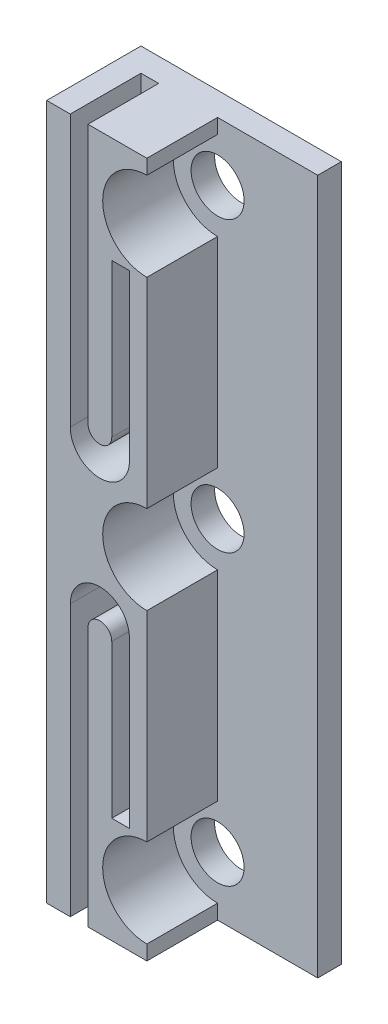
ISO-10303-21;
HEADER;
FILE_DESCRIPTION(('STEP AP214'),'2;1');
FILE_NAME('part.step','',(''),(''),'','','');
FILE_SCHEMA(('AUTOMOTIVE_DESIGN { 1 0 10303 214 1 1 1 1 }'));
ENDSEC;
DATA;
#1=APPLICATION_CONTEXT('core data for automotive mechanical design processes');
#2=APPLICATION_PROTOCOL_DEFINITION('international standard','automotive_design',2000,#1);
#3=PRODUCT_CONTEXT('',#1,'mechanical');
#4=PRODUCT('Part','Part','',(#3));
#5=PRODUCT_RELATED_PRODUCT_CATEGORY('part','',(#4));
#6=PRODUCT_DEFINITION_FORMATION('','',#4);
#7=PRODUCT_DEFINITION_CONTEXT('part definition',#1,'design');
#8=PRODUCT_DEFINITION('design','',#6,#7);
#9=PRODUCT_DEFINITION_SHAPE('','',#8);
#10=(LENGTH_UNIT() NAMED_UNIT(*) SI_UNIT(.MILLI.,.METRE.));
#11=(NAMED_UNIT(*) PLANE_ANGLE_UNIT() SI_UNIT($,.RADIAN.));
#12=(NAMED_UNIT(*) SI_UNIT($,.STERADIAN.) SOLID_ANGLE_UNIT());
#13=UNCERTAINTY_MEASURE_WITH_UNIT(LENGTH_MEASURE(1.E-05),#10,'distance_accuracy_value','');
#14=(GEOMETRIC_REPRESENTATION_CONTEXT(3) GLOBAL_UNCERTAINTY_ASSIGNED_CONTEXT((#13)) GLOBAL_UNIT_ASSIGNED_CONTEXT((#10,
#11,#12)) REPRESENTATION_CONTEXT('',''));
#15=CARTESIAN_POINT('',(0.,0.,0.));
#16=DIRECTION('',(0.,0.,1.));
#17=DIRECTION('',(1.,0.,0.));
#18=AXIS2_PLACEMENT_3D('',#15,#16,#17);
#19=CARTESIAN_POINT('',(8.50000000000001,-5.,-14.));
#20=DIRECTION('',(0.,0.,1.));
#21=DIRECTION('',(1.,0.,0.));
#22=AXIS2_PLACEMENT_3D('',#19,#20,#21);
#23=CYLINDRICAL_SURFACE('',#22,2.25);
#24=CARTESIAN_POINT('',(8.50000000000001,-5.,0.));
#25=DIRECTION('',(0.,0.,1.));
#26=DIRECTION('',(1.,0.,0.));
#27=AXIS2_PLACEMENT_3D('',#24,#25,#26);
#28=CIRCLE('',#27,2.25);
#29=CARTESIAN_POINT('',(10.75,-5.,0.));
#30=VERTEX_POINT('',#29);
#31=EDGE_CURVE('E394',#30,#30,#28,.T.);
#32=ORIENTED_EDGE('',*,*,#31,.F.);
#33=EDGE_LOOP('',(#32));
#34=FACE_BOUND('',#33,.T.);
#35=CARTESIAN_POINT('',(8.50000000000001,-5.,2.));
#36=DIRECTION('',(0.,0.,1.));
#37=DIRECTION('',(1.,0.,0.));
#38=AXIS2_PLACEMENT_3D('',#35,#36,#37);
#39=CIRCLE('',#38,2.25);
#40=CARTESIAN_POINT('',(10.75,-5.,2.));
#41=VERTEX_POINT('',#40);
#42=EDGE_CURVE('E397',#41,#41,#39,.T.);
#43=ORIENTED_EDGE('',*,*,#42,.T.);
#44=EDGE_LOOP('',(#43));
#45=FACE_BOUND('',#44,.T.);
#46=ADVANCED_FACE('F40',(#34,#45),#23,.F.);
#47=CARTESIAN_POINT('',(8.50000000000001,-54.,-14.));
#48=DIRECTION('',(0.,0.,1.));
#49=DIRECTION('',(1.,0.,0.));
#50=AXIS2_PLACEMENT_3D('',#47,#48,#49);
#51=CYLINDRICAL_SURFACE('',#50,2.25);
#52=CARTESIAN_POINT('',(8.50000000000001,-54.,0.));
#53=DIRECTION('',(0.,0.,1.));
#54=DIRECTION('',(1.,0.,0.));
#55=AXIS2_PLACEMENT_3D('',#52,#53,#54);
#56=CIRCLE('',#55,2.25);
#57=CARTESIAN_POINT('',(10.75,-54.,0.));
#58=VERTEX_POINT('',#57);
#59=EDGE_CURVE('E393',#58,#58,#56,.T.);
#60=ORIENTED_EDGE('',*,*,#59,.F.);
#61=EDGE_LOOP('',(#60));
#62=FACE_BOUND('',#61,.T.);
#63=CARTESIAN_POINT('',(8.50000000000001,-54.,2.));
#64=DIRECTION('',(0.,0.,1.));
#65=DIRECTION('',(1.,0.,0.));
#66=AXIS2_PLACEMENT_3D('',#63,#64,#65);
#67=CIRCLE('',#66,2.25);
#68=CARTESIAN_POINT('',(10.75,-54.,2.));
#69=VERTEX_POINT('',#68);
#70=EDGE_CURVE('E390',#69,#69,#67,.T.);
#71=ORIENTED_EDGE('',*,*,#70,.T.);
#72=EDGE_LOOP('',(#71));
#73=FACE_BOUND('',#72,.T.);
#74=ADVANCED_FACE('F477',(#62,#73),#51,.F.);
#75=CARTESIAN_POINT('',(8.5,-29.5,-14.));
#76=DIRECTION('',(0.,0.,1.));
#77=DIRECTION('',(1.,0.,0.));
#78=AXIS2_PLACEMENT_3D('',#75,#76,#77);
#79=CYLINDRICAL_SURFACE('',#78,2.25);
#80=CARTESIAN_POINT('',(8.5,-29.5,0.));
#81=DIRECTION('',(0.,0.,1.));
#82=DIRECTION('',(1.,0.,0.));
#83=AXIS2_PLACEMENT_3D('',#80,#81,#82);
#84=CIRCLE('',#83,2.25);
#85=CARTESIAN_POINT('',(10.75,-29.5,0.));
#86=VERTEX_POINT('',#85);
#87=EDGE_CURVE('E367',#86,#86,#84,.T.);
#88=ORIENTED_EDGE('',*,*,#87,.F.);
#89=EDGE_LOOP('',(#88));
#90=FACE_BOUND('',#89,.T.);
#91=CARTESIAN_POINT('',(8.5,-29.5,2.));
#92=DIRECTION('',(0.,0.,1.));
#93=DIRECTION('',(1.,0.,0.));
#94=AXIS2_PLACEMENT_3D('',#91,#92,#93);
#95=CIRCLE('',#94,2.25);
#96=CARTESIAN_POINT('',(10.75,-29.5,2.));
#97=VERTEX_POINT('',#96);
#98=EDGE_CURVE('E387',#97,#97,#95,.T.);
#99=ORIENTED_EDGE('',*,*,#98,.T.);
#100=EDGE_LOOP('',(#99));
#101=FACE_BOUND('',#100,.T.);
#102=ADVANCED_FACE('F480',(#90,#101),#79,.F.);
#103=CARTESIAN_POINT('',(8.50000000000001,0.,8.));
#104=DIRECTION('',(-1.,0.,0.));
#105=DIRECTION('',(0.,0.,1.));
#106=AXIS2_PLACEMENT_3D('',#103,#104,#105);
#107=PLANE('',#106);
#108=DIRECTION('',(0.,1.,0.));
#109=VECTOR('',#108,1.);
#110=CARTESIAN_POINT('',(8.50000000000001,0.,2.));
#111=LINE('',#110,#109);
#112=CARTESIAN_POINT('',(8.50000000000001,-59.,2.));
#113=VERTEX_POINT('',#112);
#114=CARTESIAN_POINT('',(8.50000000000001,-57.75,2.));
#115=VERTEX_POINT('',#114);
#116=EDGE_CURVE('E271',#113,#115,#111,.T.);
#117=ORIENTED_EDGE('',*,*,#116,.T.);
#118=DIRECTION('',(0.,0.,1.));
#119=VECTOR('',#118,1.);
#120=CARTESIAN_POINT('',(8.50000000000001,-57.75,2.));
#121=LINE('',#120,#119);
#122=CARTESIAN_POINT('',(8.50000000000001,-57.75,8.));
#123=VERTEX_POINT('',#122);
#124=EDGE_CURVE('E235',#115,#123,#121,.T.);
#125=ORIENTED_EDGE('',*,*,#124,.T.);
#126=DIRECTION('',(0.,1.,0.));
#127=VECTOR('',#126,1.);
#128=CARTESIAN_POINT('',(8.50000000000001,0.,8.));
#129=LINE('',#128,#127);
#130=CARTESIAN_POINT('',(8.50000000000001,-59.,8.));
#131=VERTEX_POINT('',#130);
#132=EDGE_CURVE('E246',#131,#123,#129,.T.);
#133=ORIENTED_EDGE('',*,*,#132,.F.);
#134=DIRECTION('',(0.,0.,-1.));
#135=VECTOR('',#134,1.);
#136=CARTESIAN_POINT('',(8.50000000000001,-59.,8.));
#137=LINE('',#136,#135);
#138=EDGE_CURVE('E437',#131,#113,#137,.T.);
#139=ORIENTED_EDGE('',*,*,#138,.T.);
#140=EDGE_LOOP('',(#117,#125,#133,#139));
#141=FACE_BOUND('',#140,.T.);
#142=ADVANCED_FACE('F435',(#141),#107,.F.);
#143=CARTESIAN_POINT('',(8.50000000000001,-25.75,2.));
#144=VERTEX_POINT('',#143);
#145=CARTESIAN_POINT('',(8.50000000000001,-8.75,2.));
#146=VERTEX_POINT('',#145);
#147=EDGE_CURVE('E423',#144,#146,#111,.T.);
#148=ORIENTED_EDGE('',*,*,#147,.T.);
#149=DIRECTION('',(0.,0.,1.));
#150=VECTOR('',#149,1.);
#151=CARTESIAN_POINT('',(8.50000000000001,-8.75,2.));
#152=LINE('',#151,#150);
#153=CARTESIAN_POINT('',(8.50000000000001,-8.75,8.));
#154=VERTEX_POINT('',#153);
#155=EDGE_CURVE('E236',#146,#154,#152,.T.);
#156=ORIENTED_EDGE('',*,*,#155,.T.);
#157=CARTESIAN_POINT('',(8.50000000000001,-25.75,8.));
#158=VERTEX_POINT('',#157);
#159=EDGE_CURVE('E252',#158,#154,#129,.T.);
#160=ORIENTED_EDGE('',*,*,#159,.F.);
#161=DIRECTION('',(0.,0.,1.));
#162=VECTOR('',#161,1.);
#163=CARTESIAN_POINT('',(8.50000000000001,-25.75,2.));
#164=LINE('',#163,#162);
#165=EDGE_CURVE('E400',#158,#144,#164,.F.);
#166=ORIENTED_EDGE('',*,*,#165,.T.);
#167=EDGE_LOOP('',(#148,#156,#160,#166));
#168=FACE_BOUND('',#167,.T.);
#169=ADVANCED_FACE('F427',(#168),#107,.F.);
#170=CARTESIAN_POINT('',(8.50000000000001,-50.25,8.));
#171=VERTEX_POINT('',#170);
#172=CARTESIAN_POINT('',(8.50000000000001,-33.25,8.));
#173=VERTEX_POINT('',#172);
#174=EDGE_CURVE('E243',#171,#173,#129,.T.);
#175=ORIENTED_EDGE('',*,*,#174,.F.);
#176=DIRECTION('',(0.,0.,1.));
#177=VECTOR('',#176,1.);
#178=CARTESIAN_POINT('',(8.50000000000001,-50.25,2.));
#179=LINE('',#178,#177);
#180=CARTESIAN_POINT('',(8.50000000000001,-50.25,2.));
#181=VERTEX_POINT('',#180);
#182=EDGE_CURVE('E225',#171,#181,#179,.F.);
#183=ORIENTED_EDGE('',*,*,#182,.T.);
#184=CARTESIAN_POINT('',(8.50000000000001,-33.25,2.));
#185=VERTEX_POINT('',#184);
#186=EDGE_CURVE('E429',#181,#185,#111,.T.);
#187=ORIENTED_EDGE('',*,*,#186,.T.);
#188=DIRECTION('',(0.,0.,1.));
#189=VECTOR('',#188,1.);
#190=CARTESIAN_POINT('',(8.50000000000001,-33.25,2.));
#191=LINE('',#190,#189);
#192=EDGE_CURVE('E251',#185,#173,#191,.T.);
#193=ORIENTED_EDGE('',*,*,#192,.T.);
#194=EDGE_LOOP('',(#175,#183,#187,#193));
#195=FACE_BOUND('',#194,.T.);
#196=ADVANCED_FACE('F249',(#195),#107,.F.);
#197=CARTESIAN_POINT('',(0.,0.,2.));
#198=DIRECTION('',(0.,-1.,0.));
#199=DIRECTION('',(0.,0.,-1.));
#200=AXIS2_PLACEMENT_3D('',#197,#198,#199);
#201=PLANE('',#200);
#202=DIRECTION('',(0.,0.,1.));
#203=VECTOR('',#202,1.);
#204=CARTESIAN_POINT('',(2.00000000000001,0.,2.));
#205=LINE('',#204,#203);
#206=CARTESIAN_POINT('',(2.00000000000001,0.,2.));
#207=VERTEX_POINT('',#206);
#208=CARTESIAN_POINT('',(2.00000000000001,0.,8.));
#209=VERTEX_POINT('',#208);
#210=EDGE_CURVE('E286',#207,#209,#205,.T.);
#211=ORIENTED_EDGE('',*,*,#210,.F.);
#212=DIRECTION('',(-1.,0.,0.));
#213=VECTOR('',#212,1.);
#214=CARTESIAN_POINT('',(0.,0.,2.));
#215=LINE('',#214,#213);
#216=CARTESIAN_POINT('',(3.50000000000001,0.,2.));
#217=VERTEX_POINT('',#216);
#218=EDGE_CURVE('E312',#217,#207,#215,.T.);
#219=ORIENTED_EDGE('',*,*,#218,.F.);
#220=DIRECTION('',(0.,0.,1.));
#221=VECTOR('',#220,1.);
#222=CARTESIAN_POINT('',(3.50000000000001,0.,2.));
#223=LINE('',#222,#221);
#224=CARTESIAN_POINT('',(3.50000000000001,0.,8.));
#225=VERTEX_POINT('',#224);
#226=EDGE_CURVE('E283',#217,#225,#223,.T.);
#227=ORIENTED_EDGE('',*,*,#226,.T.);
#228=DIRECTION('',(-1.,0.,0.));
#229=VECTOR('',#228,1.);
#230=CARTESIAN_POINT('',(0.,0.,8.));
#231=LINE('',#230,#229);
#232=CARTESIAN_POINT('',(8.50000000000001,0.,8.));
#233=VERTEX_POINT('',#232);
#234=EDGE_CURVE('E595',#233,#225,#231,.T.);
#235=ORIENTED_EDGE('',*,*,#234,.F.);
#236=DIRECTION('',(0.,0.,-1.));
#237=VECTOR('',#236,1.);
#238=CARTESIAN_POINT('',(8.50000000000001,0.,8.));
#239=LINE('',#238,#237);
#240=CARTESIAN_POINT('',(8.50000000000001,0.,2.));
#241=VERTEX_POINT('',#240);
#242=EDGE_CURVE('E600',#233,#241,#239,.T.);
#243=ORIENTED_EDGE('',*,*,#242,.T.);
#244=DIRECTION('',(-1.,0.,0.));
#245=VECTOR('',#244,1.);
#246=CARTESIAN_POINT('',(0.,0.,2.));
#247=LINE('',#246,#245);
#248=CARTESIAN_POINT('',(17.,0.,2.));
#249=VERTEX_POINT('',#248);
#250=EDGE_CURVE('E450',#249,#241,#247,.T.);
#251=ORIENTED_EDGE('',*,*,#250,.F.);
#252=DIRECTION('',(0.,0.,-1.));
#253=VECTOR('',#252,1.);
#254=CARTESIAN_POINT('',(17.,0.,2.));
#255=LINE('',#254,#253);
#256=CARTESIAN_POINT('',(17.,0.,0.));
#257=VERTEX_POINT('',#256);
#258=EDGE_CURVE('E466',#249,#257,#255,.T.);
#259=ORIENTED_EDGE('',*,*,#258,.T.);
#260=DIRECTION('',(-1.,0.,0.));
#261=VECTOR('',#260,1.);
#262=CARTESIAN_POINT('',(0.,0.,0.));
#263=LINE('',#262,#261);
#264=CARTESIAN_POINT('',(0.,0.,0.));
#265=VERTEX_POINT('',#264);
#266=EDGE_CURVE('E448',#257,#265,#263,.T.);
#267=ORIENTED_EDGE('',*,*,#266,.T.);
#268=DIRECTION('',(0.,0.,-1.));
#269=VECTOR('',#268,1.);
#270=CARTESIAN_POINT('',(0.,0.,2.));
#271=LINE('',#270,#269);
#272=CARTESIAN_POINT('',(0.,0.,8.));
#273=VERTEX_POINT('',#272);
#274=EDGE_CURVE('E457',#273,#265,#271,.T.);
#275=ORIENTED_EDGE('',*,*,#274,.F.);
#276=EDGE_CURVE('E255',#209,#273,#231,.T.);
#277=ORIENTED_EDGE('',*,*,#276,.F.);
#278=EDGE_LOOP('',(#211,#219,#227,#235,#243,#251,#259,#267,#275,#277));
#279=FACE_BOUND('',#278,.T.);
#280=ADVANCED_FACE('F567',(#279),#201,.F.);
#281=CARTESIAN_POINT('',(0.,0.,8.));
#282=DIRECTION('',(0.,0.,1.));
#283=DIRECTION('',(1.,0.,0.));
#284=AXIS2_PLACEMENT_3D('',#281,#282,#283);
#285=PLANE('',#284);
#286=CARTESIAN_POINT('',(8.50000000000001,-5.,8.));
#287=DIRECTION('',(0.,0.,1.));
#288=DIRECTION('',(1.,0.,0.));
#289=AXIS2_PLACEMENT_3D('',#286,#287,#288);
#290=CIRCLE('',#289,3.75);
#291=CARTESIAN_POINT('',(8.50000000000001,-1.25,8.));
#292=VERTEX_POINT('',#291);
#293=EDGE_CURVE('E414',#292,#154,#290,.T.);
#294=ORIENTED_EDGE('',*,*,#293,.F.);
#295=EDGE_CURVE('E254',#292,#233,#129,.T.);
#296=ORIENTED_EDGE('',*,*,#295,.T.);
#297=ORIENTED_EDGE('',*,*,#234,.T.);
#298=DIRECTION('',(0.,1.,0.));
#299=VECTOR('',#298,1.);
#300=CARTESIAN_POINT('',(3.50000000000001,0.,8.));
#301=LINE('',#300,#299);
#302=CARTESIAN_POINT('',(3.50000000000001,-22.,8.));
#303=VERTEX_POINT('',#302);
#304=EDGE_CURVE('E295',#303,#225,#301,.T.);
#305=ORIENTED_EDGE('',*,*,#304,.F.);
#306=CARTESIAN_POINT('',(4.5099627510071,-22.,8.));
#307=DIRECTION('',(0.,0.,1.));
#308=DIRECTION('',(1.,0.,0.));
#309=AXIS2_PLACEMENT_3D('',#306,#307,#308);
#310=CIRCLE('',#309,1.00996275100709);
#311=CARTESIAN_POINT('',(5.51992550201419,-22.,8.));
#312=VERTEX_POINT('',#311);
#313=EDGE_CURVE('E297',#303,#312,#310,.T.);
#314=ORIENTED_EDGE('',*,*,#313,.T.);
#315=DIRECTION('',(0.,1.,0.));
#316=VECTOR('',#315,1.);
#317=CARTESIAN_POINT('',(5.51992550201419,0.,8.));
#318=LINE('',#317,#316);
#319=CARTESIAN_POINT('',(5.51992550201419,-9.,8.));
#320=VERTEX_POINT('',#319);
#321=EDGE_CURVE('E300',#312,#320,#318,.T.);
#322=ORIENTED_EDGE('',*,*,#321,.T.);
#323=DIRECTION('',(1.,0.,0.));
#324=VECTOR('',#323,1.);
#325=CARTESIAN_POINT('',(0.,-9.,8.));
#326=LINE('',#325,#324);
#327=CARTESIAN_POINT('',(7.01992550201417,-9.,8.));
#328=VERTEX_POINT('',#327);
#329=EDGE_CURVE('E303',#320,#328,#326,.T.);
#330=ORIENTED_EDGE('',*,*,#329,.T.);
#331=DIRECTION('',(0.,1.,0.));
#332=VECTOR('',#331,1.);
#333=CARTESIAN_POINT('',(7.01992550201417,0.,8.));
#334=LINE('',#333,#332);
#335=CARTESIAN_POINT('',(7.01992550201418,-23.,8.));
#336=VERTEX_POINT('',#335);
#337=EDGE_CURVE('E306',#336,#328,#334,.T.);
#338=ORIENTED_EDGE('',*,*,#337,.F.);
#339=CARTESIAN_POINT('',(4.50996275100709,-23.,8.));
#340=DIRECTION('',(0.,0.,1.));
#341=DIRECTION('',(1.,0.,0.));
#342=AXIS2_PLACEMENT_3D('',#339,#340,#341);
#343=CIRCLE('',#342,2.50996275100709);
#344=CARTESIAN_POINT('',(2.00000000000001,-23.,8.));
#345=VERTEX_POINT('',#344);
#346=EDGE_CURVE('E63',#345,#336,#343,.T.);
#347=ORIENTED_EDGE('',*,*,#346,.F.);
#348=DIRECTION('',(0.,1.,0.));
#349=VECTOR('',#348,1.);
#350=CARTESIAN_POINT('',(2.00000000000001,0.,8.));
#351=LINE('',#350,#349);
#352=EDGE_CURVE('E291',#345,#209,#351,.T.);
#353=ORIENTED_EDGE('',*,*,#352,.T.);
#354=ORIENTED_EDGE('',*,*,#276,.T.);
#355=DIRECTION('',(0.,-1.,0.));
#356=VECTOR('',#355,1.);
#357=CARTESIAN_POINT('',(0.,0.,8.));
#358=LINE('',#357,#356);
#359=CARTESIAN_POINT('',(0.,-59.,8.));
#360=VERTEX_POINT('',#359);
#361=EDGE_CURVE('E268',#273,#360,#358,.T.);
#362=ORIENTED_EDGE('',*,*,#361,.T.);
#363=DIRECTION('',(1.,0.,0.));
#364=VECTOR('',#363,1.);
#365=CARTESIAN_POINT('',(0.,-59.,8.));
#366=LINE('',#365,#364);
#367=CARTESIAN_POINT('',(2.00000000000001,-59.,8.));
#368=VERTEX_POINT('',#367);
#369=EDGE_CURVE('E259',#360,#368,#366,.T.);
#370=ORIENTED_EDGE('',*,*,#369,.T.);
#371=DIRECTION('',(0.,1.,0.));
#372=VECTOR('',#371,1.);
#373=CARTESIAN_POINT('',(2.00000000000001,0.,8.));
#374=LINE('',#373,#372);
#375=CARTESIAN_POINT('',(2.00000000000001,-36.,8.));
#376=VERTEX_POINT('',#375);
#377=EDGE_CURVE('E362',#368,#376,#374,.T.);
#378=ORIENTED_EDGE('',*,*,#377,.T.);
#379=CARTESIAN_POINT('',(4.5099627510071,-36.,8.));
#380=DIRECTION('',(0.,0.,1.));
#381=DIRECTION('',(1.,0.,0.));
#382=AXIS2_PLACEMENT_3D('',#379,#380,#381);
#383=CIRCLE('',#382,2.50996275100709);
#384=CARTESIAN_POINT('',(7.01992550201418,-36.,8.));
#385=VERTEX_POINT('',#384);
#386=EDGE_CURVE('E364',#376,#385,#383,.F.);
#387=ORIENTED_EDGE('',*,*,#386,.T.);
#388=DIRECTION('',(0.,1.,0.));
#389=VECTOR('',#388,1.);
#390=CARTESIAN_POINT('',(7.01992550201417,0.,8.));
#391=LINE('',#390,#389);
#392=CARTESIAN_POINT('',(7.01992550201419,-50.,8.));
#393=VERTEX_POINT('',#392);
#394=EDGE_CURVE('E346',#393,#385,#391,.T.);
#395=ORIENTED_EDGE('',*,*,#394,.F.);
#396=DIRECTION('',(1.,0.,0.));
#397=VECTOR('',#396,1.);
#398=CARTESIAN_POINT('',(0.,-50.,8.));
#399=LINE('',#398,#397);
#400=CARTESIAN_POINT('',(5.51992550201419,-50.,8.));
#401=VERTEX_POINT('',#400);
#402=EDGE_CURVE('E350',#401,#393,#399,.T.);
#403=ORIENTED_EDGE('',*,*,#402,.F.);
#404=DIRECTION('',(0.,1.,0.));
#405=VECTOR('',#404,1.);
#406=CARTESIAN_POINT('',(5.51992550201419,0.,8.));
#407=LINE('',#406,#405);
#408=CARTESIAN_POINT('',(5.51992550201419,-37.,8.));
#409=VERTEX_POINT('',#408);
#410=EDGE_CURVE('E353',#401,#409,#407,.T.);
#411=ORIENTED_EDGE('',*,*,#410,.T.);
#412=CARTESIAN_POINT('',(4.5099627510071,-37.,8.));
#413=DIRECTION('',(0.,0.,1.));
#414=DIRECTION('',(1.,0.,0.));
#415=AXIS2_PLACEMENT_3D('',#412,#413,#414);
#416=CIRCLE('',#415,1.00996275100709);
#417=CARTESIAN_POINT('',(3.50000000000001,-37.,8.));
#418=VERTEX_POINT('',#417);
#419=EDGE_CURVE('E356',#418,#409,#416,.F.);
#420=ORIENTED_EDGE('',*,*,#419,.F.);
#421=DIRECTION('',(0.,1.,0.));
#422=VECTOR('',#421,1.);
#423=CARTESIAN_POINT('',(3.50000000000001,0.,8.));
#424=LINE('',#423,#422);
#425=CARTESIAN_POINT('',(3.50000000000001,-59.,8.));
#426=VERTEX_POINT('',#425);
#427=EDGE_CURVE('E359',#426,#418,#424,.T.);
#428=ORIENTED_EDGE('',*,*,#427,.F.);
#429=EDGE_CURVE('E264',#426,#131,#366,.T.);
#430=ORIENTED_EDGE('',*,*,#429,.T.);
#431=ORIENTED_EDGE('',*,*,#132,.T.);
#432=CARTESIAN_POINT('',(8.50000000000001,-54.,8.));
#433=DIRECTION('',(0.,0.,1.));
#434=DIRECTION('',(1.,0.,0.));
#435=AXIS2_PLACEMENT_3D('',#432,#433,#434);
#436=CIRCLE('',#435,3.75);
#437=EDGE_CURVE('E228',#171,#123,#436,.T.);
#438=ORIENTED_EDGE('',*,*,#437,.F.);
#439=ORIENTED_EDGE('',*,*,#174,.T.);
#440=CARTESIAN_POINT('',(8.5,-29.5,8.));
#441=DIRECTION('',(0.,0.,1.));
#442=DIRECTION('',(1.,0.,0.));
#443=AXIS2_PLACEMENT_3D('',#440,#441,#442);
#444=CIRCLE('',#443,3.75);
#445=EDGE_CURVE('E405',#158,#173,#444,.T.);
#446=ORIENTED_EDGE('',*,*,#445,.F.);
#447=ORIENTED_EDGE('',*,*,#159,.T.);
#448=EDGE_LOOP('',(#294,#296,#297,#305,#314,#322,#330,#338,#347,#353,#354,#362,#370,#378,#387,
#395,#403,#411,#420,#428,#430,#431,#438,#439,#446,#447));
#449=FACE_BOUND('',#448,.T.);
#450=ADVANCED_FACE('F241',(#449),#285,.T.);
#451=CARTESIAN_POINT('',(0.,0.,2.));
#452=DIRECTION('',(1.,0.,0.));
#453=DIRECTION('',(0.,1.,0.));
#454=AXIS2_PLACEMENT_3D('',#451,#452,#453);
#455=PLANE('',#454);
#456=DIRECTION('',(0.,-1.,0.));
#457=VECTOR('',#456,1.);
#458=CARTESIAN_POINT('',(0.,0.,0.));
#459=LINE('',#458,#457);
#460=CARTESIAN_POINT('',(0.,-59.,0.));
#461=VERTEX_POINT('',#460);
#462=EDGE_CURVE('E458',#265,#461,#459,.T.);
#463=ORIENTED_EDGE('',*,*,#462,.T.);
#464=DIRECTION('',(0.,0.,-1.));
#465=VECTOR('',#464,1.);
#466=CARTESIAN_POINT('',(0.,-59.,2.));
#467=LINE('',#466,#465);
#468=EDGE_CURVE('E48',#360,#461,#467,.T.);
#469=ORIENTED_EDGE('',*,*,#468,.F.);
#470=ORIENTED_EDGE('',*,*,#361,.F.);
#471=ORIENTED_EDGE('',*,*,#274,.T.);
#472=EDGE_LOOP('',(#463,#469,#470,#471));
#473=FACE_BOUND('',#472,.T.);
#474=ADVANCED_FACE('F42',(#473),#455,.F.);
#475=CARTESIAN_POINT('',(0.,-59.,2.));
#476=DIRECTION('',(0.,1.,0.));
#477=DIRECTION('',(0.,0.,1.));
#478=AXIS2_PLACEMENT_3D('',#475,#476,#477);
#479=PLANE('',#478);
#480=ORIENTED_EDGE('',*,*,#429,.F.);
#481=DIRECTION('',(0.,0.,1.));
#482=VECTOR('',#481,1.);
#483=CARTESIAN_POINT('',(3.50000000000001,-59.,2.));
#484=LINE('',#483,#482);
#485=CARTESIAN_POINT('',(3.50000000000001,-59.,2.));
#486=VERTEX_POINT('',#485);
#487=EDGE_CURVE('E335',#486,#426,#484,.T.);
#488=ORIENTED_EDGE('',*,*,#487,.F.);
#489=DIRECTION('',(1.,0.,0.));
#490=VECTOR('',#489,1.);
#491=CARTESIAN_POINT('',(0.,-59.,2.));
#492=LINE('',#491,#490);
#493=CARTESIAN_POINT('',(2.00000000000001,-59.,2.));
#494=VERTEX_POINT('',#493);
#495=EDGE_CURVE('E381',#494,#486,#492,.T.);
#496=ORIENTED_EDGE('',*,*,#495,.F.);
#497=DIRECTION('',(0.,0.,1.));
#498=VECTOR('',#497,1.);
#499=CARTESIAN_POINT('',(2.00000000000001,-59.,2.));
#500=LINE('',#499,#498);
#501=EDGE_CURVE('E331',#494,#368,#500,.T.);
#502=ORIENTED_EDGE('',*,*,#501,.T.);
#503=ORIENTED_EDGE('',*,*,#369,.F.);
#504=ORIENTED_EDGE('',*,*,#468,.T.);
#505=DIRECTION('',(1.,0.,0.));
#506=VECTOR('',#505,1.);
#507=CARTESIAN_POINT('',(0.,-59.,0.));
#508=LINE('',#507,#506);
#509=CARTESIAN_POINT('',(17.,-59.,0.));
#510=VERTEX_POINT('',#509);
#511=EDGE_CURVE('E461',#461,#510,#508,.T.);
#512=ORIENTED_EDGE('',*,*,#511,.T.);
#513=DIRECTION('',(0.,0.,-1.));
#514=VECTOR('',#513,1.);
#515=CARTESIAN_POINT('',(17.,-59.,2.));
#516=LINE('',#515,#514);
#517=CARTESIAN_POINT('',(17.,-59.,2.));
#518=VERTEX_POINT('',#517);
#519=EDGE_CURVE('E445',#518,#510,#516,.T.);
#520=ORIENTED_EDGE('',*,*,#519,.F.);
#521=DIRECTION('',(1.,0.,0.));
#522=VECTOR('',#521,1.);
#523=CARTESIAN_POINT('',(0.,-59.,2.));
#524=LINE('',#523,#522);
#525=EDGE_CURVE('E439',#113,#518,#524,.T.);
#526=ORIENTED_EDGE('',*,*,#525,.F.);
#527=ORIENTED_EDGE('',*,*,#138,.F.);
#528=EDGE_LOOP('',(#480,#488,#496,#502,#503,#504,#512,#520,#526,#527));
#529=FACE_BOUND('',#528,.T.);
#530=ADVANCED_FACE('F443',(#529),#479,.F.);
#531=CARTESIAN_POINT('',(17.,0.,2.));
#532=DIRECTION('',(-1.,0.,0.));
#533=DIRECTION('',(0.,-1.,0.));
#534=AXIS2_PLACEMENT_3D('',#531,#532,#533);
#535=PLANE('',#534);
#536=DIRECTION('',(0.,1.,0.));
#537=VECTOR('',#536,1.);
#538=CARTESIAN_POINT('',(17.,0.,0.));
#539=LINE('',#538,#537);
#540=EDGE_CURVE('E452',#510,#257,#539,.T.);
#541=ORIENTED_EDGE('',*,*,#540,.T.);
#542=ORIENTED_EDGE('',*,*,#258,.F.);
#543=DIRECTION('',(0.,1.,0.));
#544=VECTOR('',#543,1.);
#545=CARTESIAN_POINT('',(17.,0.,2.));
#546=LINE('',#545,#544);
#547=EDGE_CURVE('E447',#518,#249,#546,.T.);
#548=ORIENTED_EDGE('',*,*,#547,.F.);
#549=ORIENTED_EDGE('',*,*,#519,.T.);
#550=EDGE_LOOP('',(#541,#542,#548,#549));
#551=FACE_BOUND('',#550,.T.);
#552=ADVANCED_FACE('F486',(#551),#535,.F.);
#553=CARTESIAN_POINT('',(0.,0.,2.));
#554=DIRECTION('',(0.,0.,1.));
#555=DIRECTION('',(1.,0.,0.));
#556=AXIS2_PLACEMENT_3D('',#553,#554,#555);
#557=PLANE('',#556);
#558=ORIENTED_EDGE('',*,*,#70,.F.);
#559=EDGE_LOOP('',(#558));
#560=FACE_BOUND('',#559,.T.);
#561=ORIENTED_EDGE('',*,*,#42,.F.);
#562=EDGE_LOOP('',(#561));
#563=FACE_BOUND('',#562,.T.);
#564=CARTESIAN_POINT('',(8.50000000000001,-1.25,2.));
#565=VERTEX_POINT('',#564);
#566=EDGE_CURVE('E290',#565,#241,#111,.T.);
#567=ORIENTED_EDGE('',*,*,#566,.F.);
#568=CARTESIAN_POINT('',(8.50000000000001,-5.,2.));
#569=DIRECTION('',(0.,0.,1.));
#570=DIRECTION('',(1.,0.,0.));
#571=AXIS2_PLACEMENT_3D('',#568,#569,#570);
#572=CIRCLE('',#571,3.75);
#573=EDGE_CURVE('E411',#565,#146,#572,.T.);
#574=ORIENTED_EDGE('',*,*,#573,.T.);
#575=ORIENTED_EDGE('',*,*,#147,.F.);
#576=CARTESIAN_POINT('',(8.5,-29.5,2.));
#577=DIRECTION('',(0.,0.,1.));
#578=DIRECTION('',(1.,0.,0.));
#579=AXIS2_PLACEMENT_3D('',#576,#577,#578);
#580=CIRCLE('',#579,3.75);
#581=EDGE_CURVE('E404',#144,#185,#580,.T.);
#582=ORIENTED_EDGE('',*,*,#581,.T.);
#583=ORIENTED_EDGE('',*,*,#186,.F.);
#584=CARTESIAN_POINT('',(8.50000000000001,-54.,2.));
#585=DIRECTION('',(0.,0.,1.));
#586=DIRECTION('',(1.,0.,0.));
#587=AXIS2_PLACEMENT_3D('',#584,#585,#586);
#588=CIRCLE('',#587,3.75);
#589=EDGE_CURVE('E231',#181,#115,#588,.T.);
#590=ORIENTED_EDGE('',*,*,#589,.T.);
#591=ORIENTED_EDGE('',*,*,#116,.F.);
#592=ORIENTED_EDGE('',*,*,#525,.T.);
#593=ORIENTED_EDGE('',*,*,#547,.T.);
#594=ORIENTED_EDGE('',*,*,#250,.T.);
#595=EDGE_LOOP('',(#567,#574,#575,#582,#583,#590,#591,#592,#593,#594));
#596=FACE_BOUND('',#595,.T.);
#597=ORIENTED_EDGE('',*,*,#98,.F.);
#598=EDGE_LOOP('',(#597));
#599=FACE_BOUND('',#598,.T.);
#600=ADVANCED_FACE('F421',(#560,#563,#596,#599),#557,.T.);
#601=CARTESIAN_POINT('',(0.,0.,0.));
#602=DIRECTION('',(0.,0.,1.));
#603=DIRECTION('',(1.,0.,0.));
#604=AXIS2_PLACEMENT_3D('',#601,#602,#603);
#605=PLANE('',#604);
#606=ORIENTED_EDGE('',*,*,#59,.T.);
#607=EDGE_LOOP('',(#606));
#608=FACE_BOUND('',#607,.T.);
#609=ORIENTED_EDGE('',*,*,#31,.T.);
#610=EDGE_LOOP('',(#609));
#611=FACE_BOUND('',#610,.T.);
#612=ORIENTED_EDGE('',*,*,#87,.T.);
#613=EDGE_LOOP('',(#612));
#614=FACE_BOUND('',#613,.T.);
#615=ORIENTED_EDGE('',*,*,#462,.F.);
#616=ORIENTED_EDGE('',*,*,#266,.F.);
#617=ORIENTED_EDGE('',*,*,#540,.F.);
#618=ORIENTED_EDGE('',*,*,#511,.F.);
#619=EDGE_LOOP('',(#615,#616,#617,#618));
#620=FACE_BOUND('',#619,.T.);
#621=ADVANCED_FACE('F474',(#608,#611,#614,#620),#605,.F.);
#622=ORIENTED_EDGE('',*,*,#295,.F.);
#623=DIRECTION('',(0.,0.,1.));
#624=VECTOR('',#623,1.);
#625=CARTESIAN_POINT('',(8.50000000000001,-1.25,2.));
#626=LINE('',#625,#624);
#627=EDGE_CURVE('E12',#292,#565,#626,.F.);
#628=ORIENTED_EDGE('',*,*,#627,.T.);
#629=ORIENTED_EDGE('',*,*,#566,.T.);
#630=ORIENTED_EDGE('',*,*,#242,.F.);
#631=EDGE_LOOP('',(#622,#628,#629,#630));
#632=FACE_BOUND('',#631,.T.);
#633=ADVANCED_FACE('F564',(#632),#107,.F.);
#634=CARTESIAN_POINT('',(4.50996275100709,-23.,2.));
#635=DIRECTION('',(0.,0.,1.));
#636=DIRECTION('',(1.,0.,0.));
#637=AXIS2_PLACEMENT_3D('',#634,#635,#636);
#638=CYLINDRICAL_SURFACE('',#637,2.50996275100709);
#639=ORIENTED_EDGE('',*,*,#346,.T.);
#640=DIRECTION('',(0.,0.,1.));
#641=VECTOR('',#640,1.);
#642=CARTESIAN_POINT('',(7.01992550201418,-23.,2.));
#643=LINE('',#642,#641);
#644=CARTESIAN_POINT('',(7.01992550201418,-23.,2.));
#645=VERTEX_POINT('',#644);
#646=EDGE_CURVE('E272',#645,#336,#643,.T.);
#647=ORIENTED_EDGE('',*,*,#646,.F.);
#648=CARTESIAN_POINT('',(4.50996275100709,-23.,2.));
#649=DIRECTION('',(0.,0.,1.));
#650=DIRECTION('',(1.,0.,0.));
#651=AXIS2_PLACEMENT_3D('',#648,#649,#650);
#652=CIRCLE('',#651,2.50996275100709);
#653=CARTESIAN_POINT('',(2.00000000000001,-23.,2.));
#654=VERTEX_POINT('',#653);
#655=EDGE_CURVE('E294',#654,#645,#652,.T.);
#656=ORIENTED_EDGE('',*,*,#655,.F.);
#657=DIRECTION('',(0.,0.,1.));
#658=VECTOR('',#657,1.);
#659=CARTESIAN_POINT('',(2.00000000000001,-23.,2.));
#660=LINE('',#659,#658);
#661=EDGE_CURVE('E288',#654,#345,#660,.T.);
#662=ORIENTED_EDGE('',*,*,#661,.T.);
#663=EDGE_LOOP('',(#639,#647,#656,#662));
#664=FACE_BOUND('',#663,.T.);
#665=ADVANCED_FACE('F542',(#664),#638,.F.);
#666=CARTESIAN_POINT('',(2.00000000000001,0.,2.));
#667=DIRECTION('',(1.,0.,0.));
#668=DIRECTION('',(0.,0.,-1.));
#669=AXIS2_PLACEMENT_3D('',#666,#667,#668);
#670=PLANE('',#669);
#671=ORIENTED_EDGE('',*,*,#352,.F.);
#672=ORIENTED_EDGE('',*,*,#661,.F.);
#673=DIRECTION('',(0.,1.,0.));
#674=VECTOR('',#673,1.);
#675=CARTESIAN_POINT('',(2.00000000000001,0.,2.));
#676=LINE('',#675,#674);
#677=EDGE_CURVE('E275',#654,#207,#676,.T.);
#678=ORIENTED_EDGE('',*,*,#677,.T.);
#679=ORIENTED_EDGE('',*,*,#210,.T.);
#680=EDGE_LOOP('',(#671,#672,#678,#679));
#681=FACE_BOUND('',#680,.T.);
#682=ADVANCED_FACE('F538',(#681),#670,.T.);
#683=CARTESIAN_POINT('',(3.50000000000001,0.,2.));
#684=DIRECTION('',(1.,0.,0.));
#685=DIRECTION('',(0.,0.,-1.));
#686=AXIS2_PLACEMENT_3D('',#683,#684,#685);
#687=PLANE('',#686);
#688=ORIENTED_EDGE('',*,*,#304,.T.);
#689=ORIENTED_EDGE('',*,*,#226,.F.);
#690=DIRECTION('',(0.,1.,0.));
#691=VECTOR('',#690,1.);
#692=CARTESIAN_POINT('',(3.50000000000001,0.,2.));
#693=LINE('',#692,#691);
#694=CARTESIAN_POINT('',(3.50000000000001,-22.,2.));
#695=VERTEX_POINT('',#694);
#696=EDGE_CURVE('E315',#695,#217,#693,.T.);
#697=ORIENTED_EDGE('',*,*,#696,.F.);
#698=DIRECTION('',(0.,0.,1.));
#699=VECTOR('',#698,1.);
#700=CARTESIAN_POINT('',(3.50000000000001,-22.,2.));
#701=LINE('',#700,#699);
#702=EDGE_CURVE('E281',#695,#303,#701,.T.);
#703=ORIENTED_EDGE('',*,*,#702,.T.);
#704=EDGE_LOOP('',(#688,#689,#697,#703));
#705=FACE_BOUND('',#704,.T.);
#706=ADVANCED_FACE('F541',(#705),#687,.F.);
#707=CARTESIAN_POINT('',(4.5099627510071,-22.,2.));
#708=DIRECTION('',(0.,0.,1.));
#709=DIRECTION('',(1.,0.,0.));
#710=AXIS2_PLACEMENT_3D('',#707,#708,#709);
#711=CYLINDRICAL_SURFACE('',#710,1.00996275100709);
#712=ORIENTED_EDGE('',*,*,#313,.F.);
#713=ORIENTED_EDGE('',*,*,#702,.F.);
#714=CARTESIAN_POINT('',(4.5099627510071,-22.,2.));
#715=DIRECTION('',(0.,0.,1.));
#716=DIRECTION('',(1.,0.,0.));
#717=AXIS2_PLACEMENT_3D('',#714,#715,#716);
#718=CIRCLE('',#717,1.00996275100709);
#719=CARTESIAN_POINT('',(5.51992550201419,-22.,2.));
#720=VERTEX_POINT('',#719);
#721=EDGE_CURVE('E318',#695,#720,#718,.T.);
#722=ORIENTED_EDGE('',*,*,#721,.T.);
#723=DIRECTION('',(0.,0.,1.));
#724=VECTOR('',#723,1.);
#725=CARTESIAN_POINT('',(5.51992550201419,-22.,2.));
#726=LINE('',#725,#724);
#727=EDGE_CURVE('E279',#720,#312,#726,.T.);
#728=ORIENTED_EDGE('',*,*,#727,.T.);
#729=EDGE_LOOP('',(#712,#713,#722,#728));
#730=FACE_BOUND('',#729,.T.);
#731=ADVANCED_FACE('F546',(#730),#711,.T.);
#732=CARTESIAN_POINT('',(5.51992550201419,0.,2.));
#733=DIRECTION('',(1.,0.,0.));
#734=DIRECTION('',(0.,0.,-1.));
#735=AXIS2_PLACEMENT_3D('',#732,#733,#734);
#736=PLANE('',#735);
#737=ORIENTED_EDGE('',*,*,#321,.F.);
#738=ORIENTED_EDGE('',*,*,#727,.F.);
#739=DIRECTION('',(0.,1.,0.));
#740=VECTOR('',#739,1.);
#741=CARTESIAN_POINT('',(5.51992550201419,0.,2.));
#742=LINE('',#741,#740);
#743=CARTESIAN_POINT('',(5.51992550201419,-9.,2.));
#744=VERTEX_POINT('',#743);
#745=EDGE_CURVE('E320',#720,#744,#742,.T.);
#746=ORIENTED_EDGE('',*,*,#745,.T.);
#747=DIRECTION('',(0.,0.,1.));
#748=VECTOR('',#747,1.);
#749=CARTESIAN_POINT('',(5.51992550201419,-9.,2.));
#750=LINE('',#749,#748);
#751=EDGE_CURVE('E277',#744,#320,#750,.T.);
#752=ORIENTED_EDGE('',*,*,#751,.T.);
#753=EDGE_LOOP('',(#737,#738,#746,#752));
#754=FACE_BOUND('',#753,.T.);
#755=ADVANCED_FACE('F550',(#754),#736,.T.);
#756=CARTESIAN_POINT('',(0.,-9.,2.));
#757=DIRECTION('',(0.,-1.,0.));
#758=DIRECTION('',(0.,0.,-1.));
#759=AXIS2_PLACEMENT_3D('',#756,#757,#758);
#760=PLANE('',#759);
#761=ORIENTED_EDGE('',*,*,#329,.F.);
#762=ORIENTED_EDGE('',*,*,#751,.F.);
#763=DIRECTION('',(1.,0.,0.));
#764=VECTOR('',#763,1.);
#765=CARTESIAN_POINT('',(0.,-9.,2.));
#766=LINE('',#765,#764);
#767=CARTESIAN_POINT('',(7.01992550201417,-9.,2.));
#768=VERTEX_POINT('',#767);
#769=EDGE_CURVE('E322',#744,#768,#766,.T.);
#770=ORIENTED_EDGE('',*,*,#769,.T.);
#771=DIRECTION('',(0.,0.,1.));
#772=VECTOR('',#771,1.);
#773=CARTESIAN_POINT('',(7.01992550201417,-9.,2.));
#774=LINE('',#773,#772);
#775=EDGE_CURVE('E274',#768,#328,#774,.T.);
#776=ORIENTED_EDGE('',*,*,#775,.T.);
#777=EDGE_LOOP('',(#761,#762,#770,#776));
#778=FACE_BOUND('',#777,.T.);
#779=ADVANCED_FACE('F554',(#778),#760,.T.);
#780=CARTESIAN_POINT('',(7.01992550201417,0.,2.));
#781=DIRECTION('',(1.,0.,0.));
#782=DIRECTION('',(0.,1.,0.));
#783=AXIS2_PLACEMENT_3D('',#780,#781,#782);
#784=PLANE('',#783);
#785=ORIENTED_EDGE('',*,*,#337,.T.);
#786=ORIENTED_EDGE('',*,*,#775,.F.);
#787=DIRECTION('',(0.,1.,0.));
#788=VECTOR('',#787,1.);
#789=CARTESIAN_POINT('',(7.01992550201417,0.,2.));
#790=LINE('',#789,#788);
#791=EDGE_CURVE('E324',#645,#768,#790,.T.);
#792=ORIENTED_EDGE('',*,*,#791,.F.);
#793=ORIENTED_EDGE('',*,*,#646,.T.);
#794=EDGE_LOOP('',(#785,#786,#792,#793));
#795=FACE_BOUND('',#794,.T.);
#796=ADVANCED_FACE('F536',(#795),#784,.F.);
#797=CARTESIAN_POINT('',(0.,0.,2.));
#798=DIRECTION('',(0.,0.,1.));
#799=DIRECTION('',(1.,0.,0.));
#800=AXIS2_PLACEMENT_3D('',#797,#798,#799);
#801=PLANE('',#800);
#802=ORIENTED_EDGE('',*,*,#655,.T.);
#803=ORIENTED_EDGE('',*,*,#791,.T.);
#804=ORIENTED_EDGE('',*,*,#769,.F.);
#805=ORIENTED_EDGE('',*,*,#745,.F.);
#806=ORIENTED_EDGE('',*,*,#721,.F.);
#807=ORIENTED_EDGE('',*,*,#696,.T.);
#808=ORIENTED_EDGE('',*,*,#218,.T.);
#809=ORIENTED_EDGE('',*,*,#677,.F.);
#810=EDGE_LOOP('',(#802,#803,#804,#805,#806,#807,#808,#809));
#811=FACE_BOUND('',#810,.T.);
#812=ADVANCED_FACE('F532',(#811),#801,.T.);
#813=CARTESIAN_POINT('',(4.5099627510071,-36.,2.));
#814=DIRECTION('',(0.,0.,1.));
#815=DIRECTION('',(1.,0.,0.));
#816=AXIS2_PLACEMENT_3D('',#813,#814,#815);
#817=CYLINDRICAL_SURFACE('',#816,2.50996275100709);
#818=ORIENTED_EDGE('',*,*,#386,.F.);
#819=DIRECTION('',(0.,0.,1.));
#820=VECTOR('',#819,1.);
#821=CARTESIAN_POINT('',(2.00000000000001,-36.,2.));
#822=LINE('',#821,#820);
#823=CARTESIAN_POINT('',(2.00000000000001,-36.,2.));
#824=VERTEX_POINT('',#823);
#825=EDGE_CURVE('E329',#824,#376,#822,.T.);
#826=ORIENTED_EDGE('',*,*,#825,.F.);
#827=CARTESIAN_POINT('',(4.5099627510071,-36.,2.));
#828=DIRECTION('',(0.,0.,1.));
#829=DIRECTION('',(1.,0.,0.));
#830=AXIS2_PLACEMENT_3D('',#827,#828,#829);
#831=CIRCLE('',#830,2.50996275100709);
#832=CARTESIAN_POINT('',(7.01992550201418,-36.,2.));
#833=VERTEX_POINT('',#832);
#834=EDGE_CURVE('E349',#824,#833,#831,.F.);
#835=ORIENTED_EDGE('',*,*,#834,.T.);
#836=DIRECTION('',(0.,0.,1.));
#837=VECTOR('',#836,1.);
#838=CARTESIAN_POINT('',(7.01992550201418,-36.,2.));
#839=LINE('',#838,#837);
#840=EDGE_CURVE('E310',#833,#385,#839,.T.);
#841=ORIENTED_EDGE('',*,*,#840,.T.);
#842=EDGE_LOOP('',(#818,#826,#835,#841));
#843=FACE_BOUND('',#842,.T.);
#844=ADVANCED_FACE('F510',(#843),#817,.F.);
#845=CARTESIAN_POINT('',(7.01992550201417,0.,2.));
#846=DIRECTION('',(1.,0.,0.));
#847=DIRECTION('',(0.,1.,0.));
#848=AXIS2_PLACEMENT_3D('',#845,#846,#847);
#849=PLANE('',#848);
#850=ORIENTED_EDGE('',*,*,#394,.T.);
#851=ORIENTED_EDGE('',*,*,#840,.F.);
#852=DIRECTION('',(0.,1.,0.));
#853=VECTOR('',#852,1.);
#854=CARTESIAN_POINT('',(7.01992550201417,0.,2.));
#855=LINE('',#854,#853);
#856=CARTESIAN_POINT('',(7.01992550201419,-50.,2.));
#857=VERTEX_POINT('',#856);
#858=EDGE_CURVE('E332',#857,#833,#855,.T.);
#859=ORIENTED_EDGE('',*,*,#858,.F.);
#860=DIRECTION('',(0.,0.,1.));
#861=VECTOR('',#860,1.);
#862=CARTESIAN_POINT('',(7.01992550201419,-50.,2.));
#863=LINE('',#862,#861);
#864=EDGE_CURVE('E343',#857,#393,#863,.T.);
#865=ORIENTED_EDGE('',*,*,#864,.T.);
#866=EDGE_LOOP('',(#850,#851,#859,#865));
#867=FACE_BOUND('',#866,.T.);
#868=ADVANCED_FACE('F506',(#867),#849,.F.);
#869=CARTESIAN_POINT('',(0.,-50.,2.));
#870=DIRECTION('',(0.,-1.,0.));
#871=DIRECTION('',(0.,0.,-1.));
#872=AXIS2_PLACEMENT_3D('',#869,#870,#871);
#873=PLANE('',#872);
#874=ORIENTED_EDGE('',*,*,#402,.T.);
#875=ORIENTED_EDGE('',*,*,#864,.F.);
#876=DIRECTION('',(1.,0.,0.));
#877=VECTOR('',#876,1.);
#878=CARTESIAN_POINT('',(0.,-50.,2.));
#879=LINE('',#878,#877);
#880=CARTESIAN_POINT('',(5.51992550201419,-50.,2.));
#881=VERTEX_POINT('',#880);
#882=EDGE_CURVE('E370',#881,#857,#879,.T.);
#883=ORIENTED_EDGE('',*,*,#882,.F.);
#884=DIRECTION('',(0.,0.,1.));
#885=VECTOR('',#884,1.);
#886=CARTESIAN_POINT('',(5.51992550201419,-50.,2.));
#887=LINE('',#886,#885);
#888=EDGE_CURVE('E341',#881,#401,#887,.T.);
#889=ORIENTED_EDGE('',*,*,#888,.T.);
#890=EDGE_LOOP('',(#874,#875,#883,#889));
#891=FACE_BOUND('',#890,.T.);
#892=ADVANCED_FACE('F509',(#891),#873,.F.);
#893=CARTESIAN_POINT('',(5.51992550201419,0.,2.));
#894=DIRECTION('',(1.,0.,0.));
#895=DIRECTION('',(0.,0.,-1.));
#896=AXIS2_PLACEMENT_3D('',#893,#894,#895);
#897=PLANE('',#896);
#898=ORIENTED_EDGE('',*,*,#410,.F.);
#899=ORIENTED_EDGE('',*,*,#888,.F.);
#900=DIRECTION('',(0.,1.,0.));
#901=VECTOR('',#900,1.);
#902=CARTESIAN_POINT('',(5.51992550201419,0.,2.));
#903=LINE('',#902,#901);
#904=CARTESIAN_POINT('',(5.51992550201419,-37.,2.));
#905=VERTEX_POINT('',#904);
#906=EDGE_CURVE('E373',#881,#905,#903,.T.);
#907=ORIENTED_EDGE('',*,*,#906,.T.);
#908=DIRECTION('',(0.,0.,1.));
#909=VECTOR('',#908,1.);
#910=CARTESIAN_POINT('',(5.51992550201419,-37.,2.));
#911=LINE('',#910,#909);
#912=EDGE_CURVE('E339',#905,#409,#911,.T.);
#913=ORIENTED_EDGE('',*,*,#912,.T.);
#914=EDGE_LOOP('',(#898,#899,#907,#913));
#915=FACE_BOUND('',#914,.T.);
#916=ADVANCED_FACE('F514',(#915),#897,.T.);
#917=CARTESIAN_POINT('',(4.5099627510071,-37.,2.));
#918=DIRECTION('',(0.,0.,1.));
#919=DIRECTION('',(1.,0.,0.));
#920=AXIS2_PLACEMENT_3D('',#917,#918,#919);
#921=CYLINDRICAL_SURFACE('',#920,1.00996275100709);
#922=ORIENTED_EDGE('',*,*,#419,.T.);
#923=ORIENTED_EDGE('',*,*,#912,.F.);
#924=CARTESIAN_POINT('',(4.5099627510071,-37.,2.));
#925=DIRECTION('',(0.,0.,1.));
#926=DIRECTION('',(1.,0.,0.));
#927=AXIS2_PLACEMENT_3D('',#924,#925,#926);
#928=CIRCLE('',#927,1.00996275100709);
#929=CARTESIAN_POINT('',(3.50000000000001,-37.,2.));
#930=VERTEX_POINT('',#929);
#931=EDGE_CURVE('E375',#930,#905,#928,.F.);
#932=ORIENTED_EDGE('',*,*,#931,.F.);
#933=DIRECTION('',(0.,0.,1.));
#934=VECTOR('',#933,1.);
#935=CARTESIAN_POINT('',(3.50000000000001,-37.,2.));
#936=LINE('',#935,#934);
#937=EDGE_CURVE('E337',#930,#418,#936,.T.);
#938=ORIENTED_EDGE('',*,*,#937,.T.);
#939=EDGE_LOOP('',(#922,#923,#932,#938));
#940=FACE_BOUND('',#939,.T.);
#941=ADVANCED_FACE('F518',(#940),#921,.T.);
#942=CARTESIAN_POINT('',(3.50000000000001,0.,2.));
#943=DIRECTION('',(1.,0.,0.));
#944=DIRECTION('',(0.,0.,-1.));
#945=AXIS2_PLACEMENT_3D('',#942,#943,#944);
#946=PLANE('',#945);
#947=ORIENTED_EDGE('',*,*,#427,.T.);
#948=ORIENTED_EDGE('',*,*,#937,.F.);
#949=DIRECTION('',(0.,1.,0.));
#950=VECTOR('',#949,1.);
#951=CARTESIAN_POINT('',(3.50000000000001,0.,2.));
#952=LINE('',#951,#950);
#953=EDGE_CURVE('E378',#486,#930,#952,.T.);
#954=ORIENTED_EDGE('',*,*,#953,.F.);
#955=ORIENTED_EDGE('',*,*,#487,.T.);
#956=EDGE_LOOP('',(#947,#948,#954,#955));
#957=FACE_BOUND('',#956,.T.);
#958=ADVANCED_FACE('F522',(#957),#946,.F.);
#959=CARTESIAN_POINT('',(2.00000000000001,0.,2.));
#960=DIRECTION('',(1.,0.,0.));
#961=DIRECTION('',(0.,0.,-1.));
#962=AXIS2_PLACEMENT_3D('',#959,#960,#961);
#963=PLANE('',#962);
#964=ORIENTED_EDGE('',*,*,#377,.F.);
#965=ORIENTED_EDGE('',*,*,#501,.F.);
#966=DIRECTION('',(0.,1.,0.));
#967=VECTOR('',#966,1.);
#968=CARTESIAN_POINT('',(2.00000000000001,0.,2.));
#969=LINE('',#968,#967);
#970=EDGE_CURVE('E55',#494,#824,#969,.T.);
#971=ORIENTED_EDGE('',*,*,#970,.T.);
#972=ORIENTED_EDGE('',*,*,#825,.T.);
#973=EDGE_LOOP('',(#964,#965,#971,#972));
#974=FACE_BOUND('',#973,.T.);
#975=ADVANCED_FACE('F505',(#974),#963,.T.);
#976=CARTESIAN_POINT('',(0.,0.,2.));
#977=DIRECTION('',(0.,0.,1.));
#978=DIRECTION('',(1.,0.,0.));
#979=AXIS2_PLACEMENT_3D('',#976,#977,#978);
#980=PLANE('',#979);
#981=ORIENTED_EDGE('',*,*,#834,.F.);
#982=ORIENTED_EDGE('',*,*,#970,.F.);
#983=ORIENTED_EDGE('',*,*,#495,.T.);
#984=ORIENTED_EDGE('',*,*,#953,.T.);
#985=ORIENTED_EDGE('',*,*,#931,.T.);
#986=ORIENTED_EDGE('',*,*,#906,.F.);
#987=ORIENTED_EDGE('',*,*,#882,.T.);
#988=ORIENTED_EDGE('',*,*,#858,.T.);
#989=EDGE_LOOP('',(#981,#982,#983,#984,#985,#986,#987,#988));
#990=FACE_BOUND('',#989,.T.);
#991=ADVANCED_FACE('F501',(#990),#980,.T.);
#992=CARTESIAN_POINT('',(8.5,-29.5,2.));
#993=DIRECTION('',(0.,0.,1.));
#994=DIRECTION('',(1.,0.,0.));
#995=AXIS2_PLACEMENT_3D('',#992,#993,#994);
#996=CYLINDRICAL_SURFACE('',#995,3.75);
#997=ORIENTED_EDGE('',*,*,#445,.T.);
#998=ORIENTED_EDGE('',*,*,#192,.F.);
#999=ORIENTED_EDGE('',*,*,#581,.F.);
#1000=ORIENTED_EDGE('',*,*,#165,.F.);
#1001=EDGE_LOOP('',(#997,#998,#999,#1000));
#1002=FACE_BOUND('',#1001,.T.);
#1003=ADVANCED_FACE('F504',(#1002),#996,.F.);
#1004=CARTESIAN_POINT('',(8.50000000000001,-54.,2.));
#1005=DIRECTION('',(0.,0.,1.));
#1006=DIRECTION('',(1.,0.,0.));
#1007=AXIS2_PLACEMENT_3D('',#1004,#1005,#1006);
#1008=CYLINDRICAL_SURFACE('',#1007,3.75);
#1009=ORIENTED_EDGE('',*,*,#589,.F.);
#1010=ORIENTED_EDGE('',*,*,#182,.F.);
#1011=ORIENTED_EDGE('',*,*,#437,.T.);
#1012=ORIENTED_EDGE('',*,*,#124,.F.);
#1013=EDGE_LOOP('',(#1009,#1010,#1011,#1012));
#1014=FACE_BOUND('',#1013,.T.);
#1015=ADVANCED_FACE('F227',(#1014),#1008,.F.);
#1016=CARTESIAN_POINT('',(8.50000000000001,-5.,2.));
#1017=DIRECTION('',(0.,0.,1.));
#1018=DIRECTION('',(1.,0.,0.));
#1019=AXIS2_PLACEMENT_3D('',#1016,#1017,#1018);
#1020=CYLINDRICAL_SURFACE('',#1019,3.75);
#1021=ORIENTED_EDGE('',*,*,#573,.F.);
#1022=ORIENTED_EDGE('',*,*,#627,.F.);
#1023=ORIENTED_EDGE('',*,*,#293,.T.);
#1024=ORIENTED_EDGE('',*,*,#155,.F.);
#1025=EDGE_LOOP('',(#1021,#1022,#1023,#1024));
#1026=FACE_BOUND('',#1025,.T.);
#1027=ADVANCED_FACE('F617',(#1026),#1020,.F.);
#1028=CLOSED_SHELL('',(#46,#74,#102,#142,#169,#196,#280,#450,#474,#530,#552,#600,#621,#633,#665,
#682,#706,#731,#755,#779,#796,#812,#844,#868,#892,#916,#941,#958,#975,#991,#1003,#1015,#1027));
#1029=MANIFOLD_SOLID_BREP('B2',#1028);
#1030=ADVANCED_BREP_SHAPE_REPRESENTATION('',(#18,#1029),#14);
#1031=SHAPE_DEFINITION_REPRESENTATION(#9,#1030);
ENDSEC;
END-ISO-10303-21;
